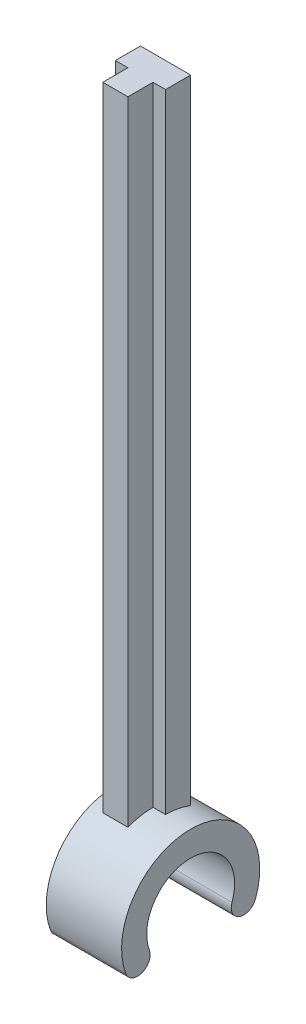
ISO-10303-21;
HEADER;
FILE_DESCRIPTION(('STEP AP214'),'2;1');
FILE_NAME('part.step','',(''),(''),'','','');
FILE_SCHEMA(('AUTOMOTIVE_DESIGN { 1 0 10303 214 1 1 1 1 }'));
ENDSEC;
DATA;
#1=APPLICATION_CONTEXT('core data for automotive mechanical design processes');
#2=APPLICATION_PROTOCOL_DEFINITION('international standard','automotive_design',2000,#1);
#3=PRODUCT_CONTEXT('',#1,'mechanical');
#4=PRODUCT('Part','Part','',(#3));
#5=PRODUCT_RELATED_PRODUCT_CATEGORY('part','',(#4));
#6=PRODUCT_DEFINITION_FORMATION('','',#4);
#7=PRODUCT_DEFINITION_CONTEXT('part definition',#1,'design');
#8=PRODUCT_DEFINITION('design','',#6,#7);
#9=PRODUCT_DEFINITION_SHAPE('','',#8);
#10=(LENGTH_UNIT() NAMED_UNIT(*) SI_UNIT(.MILLI.,.METRE.));
#11=(NAMED_UNIT(*) PLANE_ANGLE_UNIT() SI_UNIT($,.RADIAN.));
#12=(NAMED_UNIT(*) SI_UNIT($,.STERADIAN.) SOLID_ANGLE_UNIT());
#13=UNCERTAINTY_MEASURE_WITH_UNIT(LENGTH_MEASURE(1.E-05),#10,'distance_accuracy_value','');
#14=(GEOMETRIC_REPRESENTATION_CONTEXT(3) GLOBAL_UNCERTAINTY_ASSIGNED_CONTEXT((#13)) GLOBAL_UNIT_ASSIGNED_CONTEXT((#10,
#11,#12)) REPRESENTATION_CONTEXT('',''));
#15=CARTESIAN_POINT('',(0.,0.,0.));
#16=DIRECTION('',(0.,0.,1.));
#17=DIRECTION('',(1.,0.,0.));
#18=AXIS2_PLACEMENT_3D('',#15,#16,#17);
#19=CARTESIAN_POINT('',(-2.,0.,0.));
#20=DIRECTION('',(0.,0.,1.));
#21=DIRECTION('',(0.,-1.,0.));
#22=AXIS2_PLACEMENT_3D('',#19,#20,#21);
#23=PLANE('',#22);
#24=DIRECTION('',(1.,0.,0.));
#25=VECTOR('',#24,1.);
#26=CARTESIAN_POINT('',(-2.,55.5,0.));
#27=LINE('',#26,#25);
#28=CARTESIAN_POINT('',(1.,55.5,0.));
#29=VERTEX_POINT('',#28);
#30=CARTESIAN_POINT('',(2.,55.5,0.));
#31=VERTEX_POINT('',#30);
#32=EDGE_CURVE('E198',#29,#31,#27,.T.);
#33=ORIENTED_EDGE('',*,*,#32,.F.);
#34=DIRECTION('',(0.,1.,0.));
#35=VECTOR('',#34,1.);
#36=CARTESIAN_POINT('',(1.,55.5,0.));
#37=LINE('',#36,#35);
#38=CARTESIAN_POINT('',(1.,5.50000000000001,0.));
#39=VERTEX_POINT('',#38);
#40=EDGE_CURVE('E150',#39,#29,#37,.T.);
#41=ORIENTED_EDGE('',*,*,#40,.F.);
#42=DIRECTION('',(-1.,0.,0.));
#43=VECTOR('',#42,1.);
#44=CARTESIAN_POINT('',(4.,5.5,0.));
#45=LINE('',#44,#43);
#46=CARTESIAN_POINT('',(2.,5.5,0.));
#47=VERTEX_POINT('',#46);
#48=EDGE_CURVE('E206',#47,#39,#45,.T.);
#49=ORIENTED_EDGE('',*,*,#48,.F.);
#50=DIRECTION('',(0.,-1.,0.));
#51=VECTOR('',#50,1.);
#52=CARTESIAN_POINT('',(2.,0.,0.));
#53=LINE('',#52,#51);
#54=EDGE_CURVE('E67',#31,#47,#53,.T.);
#55=ORIENTED_EDGE('',*,*,#54,.F.);
#56=EDGE_LOOP('',(#33,#41,#49,#55));
#57=FACE_BOUND('',#56,.T.);
#58=ADVANCED_FACE('F43',(#57),#23,.T.);
#59=CARTESIAN_POINT('',(4.,0.,0.));
#60=DIRECTION('',(-1.,0.,0.));
#61=DIRECTION('',(0.,0.,1.));
#62=AXIS2_PLACEMENT_3D('',#59,#60,#61);
#63=CYLINDRICAL_SURFACE('',#62,3.5);
#64=DIRECTION('',(-1.,0.,0.));
#65=VECTOR('',#64,1.);
#66=CARTESIAN_POINT('',(4.,-1.19707050163984,3.28892417275068));
#67=LINE('',#66,#65);
#68=CARTESIAN_POINT('',(4.,-1.19707050163984,3.28892417275068));
#69=VERTEX_POINT('',#68);
#70=CARTESIAN_POINT('',(-2.,-1.19707050163984,3.28892417275068));
#71=VERTEX_POINT('',#70);
#72=EDGE_CURVE('E240',#69,#71,#67,.T.);
#73=ORIENTED_EDGE('',*,*,#72,.T.);
#74=CARTESIAN_POINT('',(-2.,0.,0.));
#75=DIRECTION('',(1.,0.,0.));
#76=DIRECTION('',(0.,0.,-1.));
#77=AXIS2_PLACEMENT_3D('',#74,#75,#76);
#78=CIRCLE('',#77,3.5);
#79=CARTESIAN_POINT('',(-2.,-1.19707050163984,-3.28892417275068));
#80=VERTEX_POINT('',#79);
#81=EDGE_CURVE('E210',#80,#71,#78,.T.);
#82=ORIENTED_EDGE('',*,*,#81,.F.);
#83=DIRECTION('',(-1.,0.,0.));
#84=VECTOR('',#83,1.);
#85=CARTESIAN_POINT('',(4.,-1.19707050163984,-3.28892417275068));
#86=LINE('',#85,#84);
#87=CARTESIAN_POINT('',(4.,-1.19707050163984,-3.28892417275068));
#88=VERTEX_POINT('',#87);
#89=EDGE_CURVE('E251',#88,#80,#86,.T.);
#90=ORIENTED_EDGE('',*,*,#89,.F.);
#91=CARTESIAN_POINT('',(4.,0.,0.));
#92=DIRECTION('',(1.,0.,0.));
#93=DIRECTION('',(0.,0.,-1.));
#94=AXIS2_PLACEMENT_3D('',#91,#92,#93);
#95=CIRCLE('',#94,3.5);
#96=EDGE_CURVE('E226',#88,#69,#95,.T.);
#97=ORIENTED_EDGE('',*,*,#96,.T.);
#98=EDGE_LOOP('',(#73,#82,#90,#97));
#99=FACE_BOUND('',#98,.T.);
#100=ADVANCED_FACE('F45',(#99),#63,.F.);
#101=CARTESIAN_POINT('',(4.,-1.53909064496551,-4.22861679353659));
#102=DIRECTION('',(-1.,0.,0.));
#103=DIRECTION('',(0.,0.,1.));
#104=AXIS2_PLACEMENT_3D('',#101,#102,#103);
#105=CYLINDRICAL_SURFACE('',#104,1.);
#106=ORIENTED_EDGE('',*,*,#89,.T.);
#107=CARTESIAN_POINT('',(-2.,-1.53909064496551,-4.22861679353659));
#108=DIRECTION('',(1.,0.,0.));
#109=DIRECTION('',(0.,0.,-1.));
#110=AXIS2_PLACEMENT_3D('',#107,#108,#109);
#111=CIRCLE('',#110,1.);
#112=CARTESIAN_POINT('',(-2.,-1.88111078829118,-5.16830941432249));
#113=VERTEX_POINT('',#112);
#114=EDGE_CURVE('E213',#113,#80,#111,.F.);
#115=ORIENTED_EDGE('',*,*,#114,.F.);
#116=DIRECTION('',(-1.,0.,0.));
#117=VECTOR('',#116,1.);
#118=CARTESIAN_POINT('',(4.,-1.88111078829118,-5.16830941432249));
#119=LINE('',#118,#117);
#120=CARTESIAN_POINT('',(4.,-1.88111078829118,-5.16830941432249));
#121=VERTEX_POINT('',#120);
#122=EDGE_CURVE('E248',#121,#113,#119,.T.);
#123=ORIENTED_EDGE('',*,*,#122,.F.);
#124=CARTESIAN_POINT('',(4.,-1.53909064496551,-4.22861679353659));
#125=DIRECTION('',(1.,0.,0.));
#126=DIRECTION('',(0.,0.,-1.));
#127=AXIS2_PLACEMENT_3D('',#124,#125,#126);
#128=CIRCLE('',#127,1.);
#129=EDGE_CURVE('E230',#121,#88,#128,.F.);
#130=ORIENTED_EDGE('',*,*,#129,.T.);
#131=EDGE_LOOP('',(#106,#115,#123,#130));
#132=FACE_BOUND('',#131,.T.);
#133=ADVANCED_FACE('F273',(#132),#105,.T.);
#134=CARTESIAN_POINT('',(4.,0.,0.));
#135=DIRECTION('',(-1.,0.,0.));
#136=DIRECTION('',(0.,0.,1.));
#137=AXIS2_PLACEMENT_3D('',#134,#135,#136);
#138=CYLINDRICAL_SURFACE('',#137,5.5);
#139=DIRECTION('',(-1.,0.,0.));
#140=VECTOR('',#139,1.);
#141=CARTESIAN_POINT('',(4.,5.1234753829798,1.99999999999999));
#142=LINE('',#141,#140);
#143=CARTESIAN_POINT('',(1.,5.1234753829798,1.99999999999999));
#144=VERTEX_POINT('',#143);
#145=CARTESIAN_POINT('',(-1.,5.1234753829798,1.99999999999999));
#146=VERTEX_POINT('',#145);
#147=EDGE_CURVE('E11',#144,#146,#142,.T.);
#148=ORIENTED_EDGE('',*,*,#147,.T.);
#149=CARTESIAN_POINT('',(-1.,0.,0.));
#150=DIRECTION('',(-1.,0.,0.));
#151=DIRECTION('',(0.,0.,1.));
#152=AXIS2_PLACEMENT_3D('',#149,#150,#151);
#153=CIRCLE('',#152,5.5);
#154=CARTESIAN_POINT('',(-1.,5.50000000000001,0.));
#155=VERTEX_POINT('',#154);
#156=EDGE_CURVE('E169',#146,#155,#153,.T.);
#157=ORIENTED_EDGE('',*,*,#156,.T.);
#158=CARTESIAN_POINT('',(-2.,5.5,0.));
#159=VERTEX_POINT('',#158);
#160=EDGE_CURVE('E205',#155,#159,#45,.T.);
#161=ORIENTED_EDGE('',*,*,#160,.T.);
#162=CARTESIAN_POINT('',(-2.,0.,0.));
#163=DIRECTION('',(1.,0.,0.));
#164=DIRECTION('',(0.,0.,-1.));
#165=AXIS2_PLACEMENT_3D('',#162,#163,#164);
#166=CIRCLE('',#165,5.5);
#167=CARTESIAN_POINT('',(-2.,-1.88111078829118,5.16830941432249));
#168=VERTEX_POINT('',#167);
#169=EDGE_CURVE('E217',#159,#168,#166,.T.);
#170=ORIENTED_EDGE('',*,*,#169,.T.);
#171=DIRECTION('',(-1.,0.,0.));
#172=VECTOR('',#171,1.);
#173=CARTESIAN_POINT('',(4.,-1.88111078829118,5.16830941432249));
#174=LINE('',#173,#172);
#175=CARTESIAN_POINT('',(4.,-1.88111078829118,5.16830941432249));
#176=VERTEX_POINT('',#175);
#177=EDGE_CURVE('E244',#176,#168,#174,.T.);
#178=ORIENTED_EDGE('',*,*,#177,.F.);
#179=CARTESIAN_POINT('',(4.,0.,0.));
#180=DIRECTION('',(1.,0.,0.));
#181=DIRECTION('',(0.,0.,-1.));
#182=AXIS2_PLACEMENT_3D('',#179,#180,#181);
#183=CIRCLE('',#182,5.5);
#184=EDGE_CURVE('E234',#121,#176,#183,.T.);
#185=ORIENTED_EDGE('',*,*,#184,.F.);
#186=ORIENTED_EDGE('',*,*,#122,.T.);
#187=CARTESIAN_POINT('',(-2.,5.1234753829798,-2.));
#188=VERTEX_POINT('',#187);
#189=EDGE_CURVE('E218',#113,#188,#166,.T.);
#190=ORIENTED_EDGE('',*,*,#189,.T.);
#191=DIRECTION('',(-1.,0.,0.));
#192=VECTOR('',#191,1.);
#193=CARTESIAN_POINT('',(4.,5.1234753829798,-2.));
#194=LINE('',#193,#192);
#195=CARTESIAN_POINT('',(2.,5.1234753829798,-2.));
#196=VERTEX_POINT('',#195);
#197=EDGE_CURVE('E197',#188,#196,#194,.F.);
#198=ORIENTED_EDGE('',*,*,#197,.T.);
#199=CARTESIAN_POINT('',(2.,0.,0.));
#200=DIRECTION('',(1.,0.,0.));
#201=DIRECTION('',(0.,0.,-1.));
#202=AXIS2_PLACEMENT_3D('',#199,#200,#201);
#203=CIRCLE('',#202,5.5);
#204=EDGE_CURVE('E52',#196,#47,#203,.T.);
#205=ORIENTED_EDGE('',*,*,#204,.T.);
#206=ORIENTED_EDGE('',*,*,#48,.T.);
#207=CARTESIAN_POINT('',(1.,0.,0.));
#208=DIRECTION('',(-1.,0.,0.));
#209=DIRECTION('',(0.,0.,1.));
#210=AXIS2_PLACEMENT_3D('',#207,#208,#209);
#211=CIRCLE('',#210,5.5);
#212=EDGE_CURVE('E141',#144,#39,#211,.T.);
#213=ORIENTED_EDGE('',*,*,#212,.F.);
#214=EDGE_LOOP('',(#148,#157,#161,#170,#178,#185,#186,#190,#198,#205,#206,#213));
#215=FACE_BOUND('',#214,.T.);
#216=ADVANCED_FACE('F256',(#215),#138,.T.);
#217=CARTESIAN_POINT('',(4.,-1.53909064496551,4.22861679353659));
#218=DIRECTION('',(-1.,0.,0.));
#219=DIRECTION('',(0.,0.,1.));
#220=AXIS2_PLACEMENT_3D('',#217,#218,#219);
#221=CYLINDRICAL_SURFACE('',#220,1.);
#222=ORIENTED_EDGE('',*,*,#177,.T.);
#223=CARTESIAN_POINT('',(-2.,-1.53909064496551,4.22861679353659));
#224=DIRECTION('',(1.,0.,0.));
#225=DIRECTION('',(0.,0.,-1.));
#226=AXIS2_PLACEMENT_3D('',#223,#224,#225);
#227=CIRCLE('',#226,1.);
#228=EDGE_CURVE('E222',#168,#71,#227,.T.);
#229=ORIENTED_EDGE('',*,*,#228,.T.);
#230=ORIENTED_EDGE('',*,*,#72,.F.);
#231=CARTESIAN_POINT('',(4.,-1.53909064496551,4.22861679353659));
#232=DIRECTION('',(1.,0.,0.));
#233=DIRECTION('',(0.,0.,-1.));
#234=AXIS2_PLACEMENT_3D('',#231,#232,#233);
#235=CIRCLE('',#234,1.);
#236=EDGE_CURVE('E237',#176,#69,#235,.T.);
#237=ORIENTED_EDGE('',*,*,#236,.F.);
#238=EDGE_LOOP('',(#222,#229,#230,#237));
#239=FACE_BOUND('',#238,.T.);
#240=ADVANCED_FACE('F314',(#239),#221,.T.);
#241=CARTESIAN_POINT('',(4.,0.,0.));
#242=DIRECTION('',(1.,0.,0.));
#243=DIRECTION('',(0.,0.,-1.));
#244=AXIS2_PLACEMENT_3D('',#241,#242,#243);
#245=PLANE('',#244);
#246=ORIENTED_EDGE('',*,*,#96,.F.);
#247=ORIENTED_EDGE('',*,*,#129,.F.);
#248=ORIENTED_EDGE('',*,*,#184,.T.);
#249=ORIENTED_EDGE('',*,*,#236,.T.);
#250=EDGE_LOOP('',(#246,#247,#248,#249));
#251=FACE_BOUND('',#250,.T.);
#252=ADVANCED_FACE('F285',(#251),#245,.T.);
#253=CARTESIAN_POINT('',(-2.,0.,0.));
#254=DIRECTION('',(1.,0.,0.));
#255=DIRECTION('',(0.,0.,-1.));
#256=AXIS2_PLACEMENT_3D('',#253,#254,#255);
#257=PLANE('',#256);
#258=ORIENTED_EDGE('',*,*,#81,.T.);
#259=ORIENTED_EDGE('',*,*,#228,.F.);
#260=ORIENTED_EDGE('',*,*,#169,.F.);
#261=DIRECTION('',(0.,-1.,0.));
#262=VECTOR('',#261,1.);
#263=CARTESIAN_POINT('',(-2.,0.,0.));
#264=LINE('',#263,#262);
#265=CARTESIAN_POINT('',(-2.,55.5,0.));
#266=VERTEX_POINT('',#265);
#267=EDGE_CURVE('E189',#266,#159,#264,.T.);
#268=ORIENTED_EDGE('',*,*,#267,.F.);
#269=DIRECTION('',(0.,0.,-1.));
#270=VECTOR('',#269,1.);
#271=CARTESIAN_POINT('',(-2.,55.5,0.));
#272=LINE('',#271,#270);
#273=CARTESIAN_POINT('',(-2.,55.5,-2.));
#274=VERTEX_POINT('',#273);
#275=EDGE_CURVE('E185',#266,#274,#272,.T.);
#276=ORIENTED_EDGE('',*,*,#275,.T.);
#277=DIRECTION('',(0.,1.,0.));
#278=VECTOR('',#277,1.);
#279=CARTESIAN_POINT('',(-2.,0.,-2.));
#280=LINE('',#279,#278);
#281=EDGE_CURVE('E182',#188,#274,#280,.T.);
#282=ORIENTED_EDGE('',*,*,#281,.F.);
#283=ORIENTED_EDGE('',*,*,#189,.F.);
#284=ORIENTED_EDGE('',*,*,#114,.T.);
#285=EDGE_LOOP('',(#258,#259,#260,#268,#276,#282,#283,#284));
#286=FACE_BOUND('',#285,.T.);
#287=ADVANCED_FACE('F278',(#286),#257,.F.);
#288=DIRECTION('',(0.,1.,0.));
#289=VECTOR('',#288,1.);
#290=CARTESIAN_POINT('',(-1.,55.5,0.));
#291=LINE('',#290,#289);
#292=CARTESIAN_POINT('',(-1.,55.5,0.));
#293=VERTEX_POINT('',#292);
#294=EDGE_CURVE('E156',#155,#293,#291,.T.);
#295=ORIENTED_EDGE('',*,*,#294,.T.);
#296=EDGE_CURVE('E194',#266,#293,#27,.T.);
#297=ORIENTED_EDGE('',*,*,#296,.F.);
#298=ORIENTED_EDGE('',*,*,#267,.T.);
#299=ORIENTED_EDGE('',*,*,#160,.F.);
#300=EDGE_LOOP('',(#295,#297,#298,#299));
#301=FACE_BOUND('',#300,.T.);
#302=ADVANCED_FACE('F269',(#301),#23,.T.);
#303=CARTESIAN_POINT('',(-2.,0.,-2.));
#304=DIRECTION('',(0.,0.,-1.));
#305=DIRECTION('',(-1.,0.,0.));
#306=AXIS2_PLACEMENT_3D('',#303,#304,#305);
#307=PLANE('',#306);
#308=ORIENTED_EDGE('',*,*,#197,.F.);
#309=ORIENTED_EDGE('',*,*,#281,.T.);
#310=DIRECTION('',(1.,0.,0.));
#311=VECTOR('',#310,1.);
#312=CARTESIAN_POINT('',(-2.,55.5,-2.));
#313=LINE('',#312,#311);
#314=CARTESIAN_POINT('',(2.,55.5,-2.));
#315=VERTEX_POINT('',#314);
#316=EDGE_CURVE('E193',#274,#315,#313,.T.);
#317=ORIENTED_EDGE('',*,*,#316,.T.);
#318=DIRECTION('',(0.,1.,0.));
#319=VECTOR('',#318,1.);
#320=CARTESIAN_POINT('',(2.,0.,-2.));
#321=LINE('',#320,#319);
#322=EDGE_CURVE('E173',#196,#315,#321,.T.);
#323=ORIENTED_EDGE('',*,*,#322,.F.);
#324=EDGE_LOOP('',(#308,#309,#317,#323));
#325=FACE_BOUND('',#324,.T.);
#326=ADVANCED_FACE('F260',(#325),#307,.T.);
#327=CARTESIAN_POINT('',(-2.,55.5,0.));
#328=DIRECTION('',(0.,-1.,0.));
#329=DIRECTION('',(0.,0.,-1.));
#330=AXIS2_PLACEMENT_3D('',#327,#328,#329);
#331=PLANE('',#330);
#332=ORIENTED_EDGE('',*,*,#296,.T.);
#333=DIRECTION('',(0.,0.,1.));
#334=VECTOR('',#333,1.);
#335=CARTESIAN_POINT('',(-1.,55.5,0.));
#336=LINE('',#335,#334);
#337=CARTESIAN_POINT('',(-1.,55.5,2.));
#338=VERTEX_POINT('',#337);
#339=EDGE_CURVE('E135',#293,#338,#336,.T.);
#340=ORIENTED_EDGE('',*,*,#339,.T.);
#341=DIRECTION('',(1.,0.,0.));
#342=VECTOR('',#341,1.);
#343=CARTESIAN_POINT('',(-1.,55.5,2.));
#344=LINE('',#343,#342);
#345=CARTESIAN_POINT('',(1.,55.5,2.));
#346=VERTEX_POINT('',#345);
#347=EDGE_CURVE('E132',#338,#346,#344,.T.);
#348=ORIENTED_EDGE('',*,*,#347,.T.);
#349=DIRECTION('',(0.,0.,1.));
#350=VECTOR('',#349,1.);
#351=CARTESIAN_POINT('',(1.,55.5,0.));
#352=LINE('',#351,#350);
#353=EDGE_CURVE('E59',#29,#346,#352,.T.);
#354=ORIENTED_EDGE('',*,*,#353,.F.);
#355=ORIENTED_EDGE('',*,*,#32,.T.);
#356=DIRECTION('',(0.,0.,-1.));
#357=VECTOR('',#356,1.);
#358=CARTESIAN_POINT('',(2.,55.5,0.));
#359=LINE('',#358,#357);
#360=EDGE_CURVE('E176',#31,#315,#359,.T.);
#361=ORIENTED_EDGE('',*,*,#360,.T.);
#362=ORIENTED_EDGE('',*,*,#316,.F.);
#363=ORIENTED_EDGE('',*,*,#275,.F.);
#364=EDGE_LOOP('',(#332,#340,#348,#354,#355,#361,#362,#363));
#365=FACE_BOUND('',#364,.T.);
#366=ADVANCED_FACE('F134',(#365),#331,.F.);
#367=CARTESIAN_POINT('',(2.,0.,0.));
#368=DIRECTION('',(1.,0.,0.));
#369=DIRECTION('',(0.,0.,-1.));
#370=AXIS2_PLACEMENT_3D('',#367,#368,#369);
#371=PLANE('',#370);
#372=ORIENTED_EDGE('',*,*,#204,.F.);
#373=ORIENTED_EDGE('',*,*,#322,.T.);
#374=ORIENTED_EDGE('',*,*,#360,.F.);
#375=ORIENTED_EDGE('',*,*,#54,.T.);
#376=EDGE_LOOP('',(#372,#373,#374,#375));
#377=FACE_BOUND('',#376,.T.);
#378=ADVANCED_FACE('F258',(#377),#371,.T.);
#379=CARTESIAN_POINT('',(-1.,55.5,2.));
#380=DIRECTION('',(0.,0.,1.));
#381=DIRECTION('',(0.,-1.,0.));
#382=AXIS2_PLACEMENT_3D('',#379,#380,#381);
#383=PLANE('',#382);
#384=ORIENTED_EDGE('',*,*,#147,.F.);
#385=DIRECTION('',(0.,-1.,0.));
#386=VECTOR('',#385,1.);
#387=CARTESIAN_POINT('',(1.,55.5,2.));
#388=LINE('',#387,#386);
#389=EDGE_CURVE('E147',#346,#144,#388,.T.);
#390=ORIENTED_EDGE('',*,*,#389,.F.);
#391=ORIENTED_EDGE('',*,*,#347,.F.);
#392=DIRECTION('',(0.,-1.,0.));
#393=VECTOR('',#392,1.);
#394=CARTESIAN_POINT('',(-1.,55.5,2.));
#395=LINE('',#394,#393);
#396=EDGE_CURVE('E142',#338,#146,#395,.T.);
#397=ORIENTED_EDGE('',*,*,#396,.T.);
#398=EDGE_LOOP('',(#384,#390,#391,#397));
#399=FACE_BOUND('',#398,.T.);
#400=ADVANCED_FACE('F154',(#399),#383,.T.);
#401=CARTESIAN_POINT('',(-1.,0.,0.));
#402=DIRECTION('',(-1.,0.,0.));
#403=DIRECTION('',(0.,0.,1.));
#404=AXIS2_PLACEMENT_3D('',#401,#402,#403);
#405=PLANE('',#404);
#406=ORIENTED_EDGE('',*,*,#156,.F.);
#407=ORIENTED_EDGE('',*,*,#396,.F.);
#408=ORIENTED_EDGE('',*,*,#339,.F.);
#409=ORIENTED_EDGE('',*,*,#294,.F.);
#410=EDGE_LOOP('',(#406,#407,#408,#409));
#411=FACE_BOUND('',#410,.T.);
#412=ADVANCED_FACE('F296',(#411),#405,.T.);
#413=CARTESIAN_POINT('',(1.,0.,0.));
#414=DIRECTION('',(-1.,0.,0.));
#415=DIRECTION('',(0.,0.,1.));
#416=AXIS2_PLACEMENT_3D('',#413,#414,#415);
#417=PLANE('',#416);
#418=ORIENTED_EDGE('',*,*,#389,.T.);
#419=ORIENTED_EDGE('',*,*,#212,.T.);
#420=ORIENTED_EDGE('',*,*,#40,.T.);
#421=ORIENTED_EDGE('',*,*,#353,.T.);
#422=EDGE_LOOP('',(#418,#419,#420,#421));
#423=FACE_BOUND('',#422,.T.);
#424=ADVANCED_FACE('F146',(#423),#417,.F.);
#425=CLOSED_SHELL('',(#58,#100,#133,#216,#240,#252,#287,#302,#326,#366,#378,#400,#412,#424));
#426=MANIFOLD_SOLID_BREP('B2',#425);
#427=ADVANCED_BREP_SHAPE_REPRESENTATION('',(#18,#426),#14);
#428=SHAPE_DEFINITION_REPRESENTATION(#9,#427);
ENDSEC;
END-ISO-10303-21;
